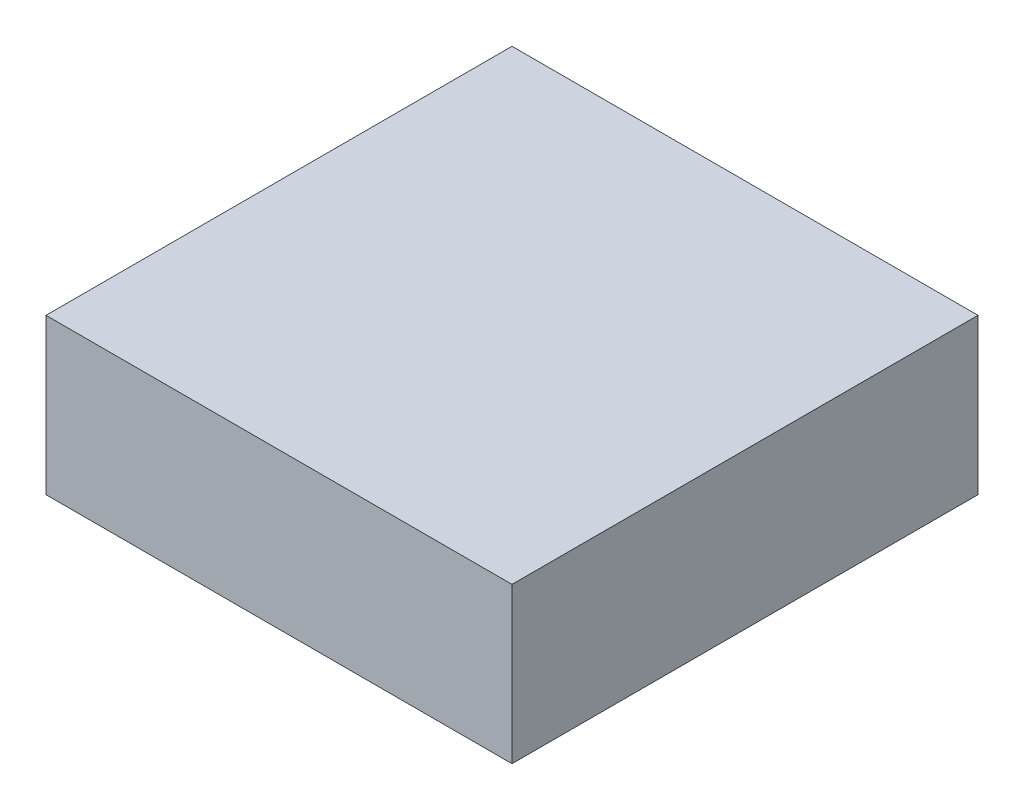
ISO-10303-21;
HEADER;
FILE_DESCRIPTION(('STEP AP214'),'2;1');
FILE_NAME('part.step','',(''),(''),'','','');
FILE_SCHEMA(('AUTOMOTIVE_DESIGN { 1 0 10303 214 1 1 1 1 }'));
ENDSEC;
DATA;
#1=APPLICATION_CONTEXT('core data for automotive mechanical design processes');
#2=APPLICATION_PROTOCOL_DEFINITION('international standard','automotive_design',2000,#1);
#3=PRODUCT_CONTEXT('',#1,'mechanical');
#4=PRODUCT('Part','Part','',(#3));
#5=PRODUCT_RELATED_PRODUCT_CATEGORY('part','',(#4));
#6=PRODUCT_DEFINITION_FORMATION('','',#4);
#7=PRODUCT_DEFINITION_CONTEXT('part definition',#1,'design');
#8=PRODUCT_DEFINITION('design','',#6,#7);
#9=PRODUCT_DEFINITION_SHAPE('','',#8);
#10=(LENGTH_UNIT() NAMED_UNIT(*) SI_UNIT(.MILLI.,.METRE.));
#11=(NAMED_UNIT(*) PLANE_ANGLE_UNIT() SI_UNIT($,.RADIAN.));
#12=(NAMED_UNIT(*) SI_UNIT($,.STERADIAN.) SOLID_ANGLE_UNIT());
#13=UNCERTAINTY_MEASURE_WITH_UNIT(LENGTH_MEASURE(1.E-05),#10,'distance_accuracy_value','');
#14=(GEOMETRIC_REPRESENTATION_CONTEXT(3) GLOBAL_UNCERTAINTY_ASSIGNED_CONTEXT((#13)) GLOBAL_UNIT_ASSIGNED_CONTEXT((#10,
#11,#12)) REPRESENTATION_CONTEXT('',''));
#15=CARTESIAN_POINT('',(0.,0.,0.));
#16=DIRECTION('',(0.,0.,1.));
#17=DIRECTION('',(1.,0.,0.));
#18=AXIS2_PLACEMENT_3D('',#15,#16,#17);
#19=CARTESIAN_POINT('',(11.5,10.,3.49999999999999));
#20=DIRECTION('',(-1.,0.,0.));
#21=DIRECTION('',(0.,0.,1.));
#22=AXIS2_PLACEMENT_3D('',#19,#20,#21);
#23=PLANE('',#22);
#24=DIRECTION('',(0.,-1.,0.));
#25=VECTOR('',#24,1.);
#26=CARTESIAN_POINT('',(11.5,10.,3.49999999999999));
#27=LINE('',#26,#25);
#28=CARTESIAN_POINT('',(11.5,7.,3.49999999999999));
#29=VERTEX_POINT('',#28);
#30=CARTESIAN_POINT('',(11.5,0.,3.49999999999999));
#31=VERTEX_POINT('',#30);
#32=EDGE_CURVE('E62',#29,#31,#27,.T.);
#33=ORIENTED_EDGE('',*,*,#32,.F.);
#34=DIRECTION('',(0.,0.,-1.));
#35=VECTOR('',#34,1.);
#36=CARTESIAN_POINT('',(11.5,7.,0.));
#37=LINE('',#36,#35);
#38=CARTESIAN_POINT('',(11.5,7.,-3.50000000000001));
#39=VERTEX_POINT('',#38);
#40=EDGE_CURVE('E55',#29,#39,#37,.T.);
#41=ORIENTED_EDGE('',*,*,#40,.T.);
#42=DIRECTION('',(0.,-1.,0.));
#43=VECTOR('',#42,1.);
#44=CARTESIAN_POINT('',(11.5,10.,-3.50000000000001));
#45=LINE('',#44,#43);
#46=CARTESIAN_POINT('',(11.5,0.,-3.50000000000001));
#47=VERTEX_POINT('',#46);
#48=EDGE_CURVE('E114',#39,#47,#45,.T.);
#49=ORIENTED_EDGE('',*,*,#48,.T.);
#50=DIRECTION('',(0.,0.,-1.));
#51=VECTOR('',#50,1.);
#52=CARTESIAN_POINT('',(11.5,0.,3.49999999999999));
#53=LINE('',#52,#51);
#54=EDGE_CURVE('E229',#31,#47,#53,.T.);
#55=ORIENTED_EDGE('',*,*,#54,.F.);
#56=EDGE_LOOP('',(#33,#41,#49,#55));
#57=FACE_BOUND('',#56,.T.);
#58=ADVANCED_FACE('F39',(#57),#23,.T.);
#59=CARTESIAN_POINT('',(-11.5,10.,-3.50000000000001));
#60=DIRECTION('',(0.,0.,1.));
#61=DIRECTION('',(1.,0.,0.));
#62=AXIS2_PLACEMENT_3D('',#59,#60,#61);
#63=PLANE('',#62);
#64=ORIENTED_EDGE('',*,*,#48,.F.);
#65=DIRECTION('',(1.,0.,0.));
#66=VECTOR('',#65,1.);
#67=CARTESIAN_POINT('',(0.,7.,-3.50000000000001));
#68=LINE('',#67,#66);
#69=CARTESIAN_POINT('',(-11.5,7.,-3.50000000000001));
#70=VERTEX_POINT('',#69);
#71=EDGE_CURVE('E104',#70,#39,#68,.T.);
#72=ORIENTED_EDGE('',*,*,#71,.F.);
#73=DIRECTION('',(0.,-1.,0.));
#74=VECTOR('',#73,1.);
#75=CARTESIAN_POINT('',(-11.5,10.,-3.50000000000001));
#76=LINE('',#75,#74);
#77=CARTESIAN_POINT('',(-11.5,0.,-3.50000000000001));
#78=VERTEX_POINT('',#77);
#79=EDGE_CURVE('E125',#70,#78,#76,.T.);
#80=ORIENTED_EDGE('',*,*,#79,.T.);
#81=DIRECTION('',(-1.,0.,0.));
#82=VECTOR('',#81,1.);
#83=CARTESIAN_POINT('',(-11.5,0.,-3.50000000000001));
#84=LINE('',#83,#82);
#85=EDGE_CURVE('E121',#47,#78,#84,.T.);
#86=ORIENTED_EDGE('',*,*,#85,.F.);
#87=EDGE_LOOP('',(#64,#72,#80,#86));
#88=FACE_BOUND('',#87,.T.);
#89=ADVANCED_FACE('F119',(#88),#63,.T.);
#90=CARTESIAN_POINT('',(-11.5,10.,3.49999999999999));
#91=DIRECTION('',(1.,0.,0.));
#92=DIRECTION('',(0.,0.,-1.));
#93=AXIS2_PLACEMENT_3D('',#90,#91,#92);
#94=PLANE('',#93);
#95=ORIENTED_EDGE('',*,*,#79,.F.);
#96=DIRECTION('',(0.,0.,-1.));
#97=VECTOR('',#96,1.);
#98=CARTESIAN_POINT('',(-11.5,7.,0.));
#99=LINE('',#98,#97);
#100=CARTESIAN_POINT('',(-11.5,7.,3.49999999999999));
#101=VERTEX_POINT('',#100);
#102=EDGE_CURVE('E107',#101,#70,#99,.T.);
#103=ORIENTED_EDGE('',*,*,#102,.F.);
#104=DIRECTION('',(0.,-1.,0.));
#105=VECTOR('',#104,1.);
#106=CARTESIAN_POINT('',(-11.5,10.,3.49999999999999));
#107=LINE('',#106,#105);
#108=CARTESIAN_POINT('',(-11.5,0.,3.49999999999999));
#109=VERTEX_POINT('',#108);
#110=EDGE_CURVE('E132',#101,#109,#107,.T.);
#111=ORIENTED_EDGE('',*,*,#110,.T.);
#112=DIRECTION('',(0.,0.,1.));
#113=VECTOR('',#112,1.);
#114=CARTESIAN_POINT('',(-11.5,0.,3.49999999999999));
#115=LINE('',#114,#113);
#116=EDGE_CURVE('E224',#78,#109,#115,.T.);
#117=ORIENTED_EDGE('',*,*,#116,.F.);
#118=EDGE_LOOP('',(#95,#103,#111,#117));
#119=FACE_BOUND('',#118,.T.);
#120=ADVANCED_FACE('F199',(#119),#94,.T.);
#121=CARTESIAN_POINT('',(-11.5,10.,3.49999999999999));
#122=DIRECTION('',(0.,0.,-1.));
#123=DIRECTION('',(-1.,0.,0.));
#124=AXIS2_PLACEMENT_3D('',#121,#122,#123);
#125=PLANE('',#124);
#126=ORIENTED_EDGE('',*,*,#110,.F.);
#127=DIRECTION('',(1.,0.,0.));
#128=VECTOR('',#127,1.);
#129=CARTESIAN_POINT('',(0.,7.,3.49999999999999));
#130=LINE('',#129,#128);
#131=EDGE_CURVE('E117',#101,#29,#130,.T.);
#132=ORIENTED_EDGE('',*,*,#131,.T.);
#133=ORIENTED_EDGE('',*,*,#32,.T.);
#134=DIRECTION('',(1.,0.,0.));
#135=VECTOR('',#134,1.);
#136=CARTESIAN_POINT('',(-11.5,0.,3.49999999999999));
#137=LINE('',#136,#135);
#138=EDGE_CURVE('E227',#109,#31,#137,.T.);
#139=ORIENTED_EDGE('',*,*,#138,.F.);
#140=EDGE_LOOP('',(#126,#132,#133,#139));
#141=FACE_BOUND('',#140,.T.);
#142=ADVANCED_FACE('F205',(#141),#125,.T.);
#143=CARTESIAN_POINT('',(0.,10.,0.));
#144=DIRECTION('',(0.,-1.,0.));
#145=DIRECTION('',(0.,0.,-1.));
#146=AXIS2_PLACEMENT_3D('',#143,#144,#145);
#147=PLANE('',#146);
#148=DIRECTION('',(0.,0.,-1.));
#149=VECTOR('',#148,1.);
#150=CARTESIAN_POINT('',(15.,10.,15.));
#151=LINE('',#150,#149);
#152=CARTESIAN_POINT('',(15.,10.,15.));
#153=VERTEX_POINT('',#152);
#154=CARTESIAN_POINT('',(15.,10.,-15.));
#155=VERTEX_POINT('',#154);
#156=EDGE_CURVE('E136',#153,#155,#151,.T.);
#157=ORIENTED_EDGE('',*,*,#156,.T.);
#158=DIRECTION('',(-1.,0.,0.));
#159=VECTOR('',#158,1.);
#160=CARTESIAN_POINT('',(-15.,10.,-15.));
#161=LINE('',#160,#159);
#162=CARTESIAN_POINT('',(-15.,10.,-15.));
#163=VERTEX_POINT('',#162);
#164=EDGE_CURVE('E140',#155,#163,#161,.T.);
#165=ORIENTED_EDGE('',*,*,#164,.T.);
#166=DIRECTION('',(0.,0.,1.));
#167=VECTOR('',#166,1.);
#168=CARTESIAN_POINT('',(-15.,10.,15.));
#169=LINE('',#168,#167);
#170=CARTESIAN_POINT('',(-15.,10.,15.));
#171=VERTEX_POINT('',#170);
#172=EDGE_CURVE('E144',#163,#171,#169,.T.);
#173=ORIENTED_EDGE('',*,*,#172,.T.);
#174=DIRECTION('',(1.,0.,0.));
#175=VECTOR('',#174,1.);
#176=CARTESIAN_POINT('',(-15.,10.,15.));
#177=LINE('',#176,#175);
#178=EDGE_CURVE('E147',#171,#153,#177,.T.);
#179=ORIENTED_EDGE('',*,*,#178,.T.);
#180=EDGE_LOOP('',(#157,#165,#173,#179));
#181=FACE_BOUND('',#180,.T.);
#182=ADVANCED_FACE('F186',(#181),#147,.F.);
#183=CARTESIAN_POINT('',(0.,0.,0.));
#184=DIRECTION('',(0.,-1.,0.));
#185=DIRECTION('',(0.,0.,-1.));
#186=AXIS2_PLACEMENT_3D('',#183,#184,#185);
#187=PLANE('',#186);
#188=DIRECTION('',(0.,0.,-1.));
#189=VECTOR('',#188,1.);
#190=CARTESIAN_POINT('',(15.,0.,15.));
#191=LINE('',#190,#189);
#192=CARTESIAN_POINT('',(15.,0.,15.));
#193=VERTEX_POINT('',#192);
#194=CARTESIAN_POINT('',(15.,0.,-15.));
#195=VERTEX_POINT('',#194);
#196=EDGE_CURVE('E124',#193,#195,#191,.T.);
#197=ORIENTED_EDGE('',*,*,#196,.F.);
#198=DIRECTION('',(1.,0.,0.));
#199=VECTOR('',#198,1.);
#200=CARTESIAN_POINT('',(-15.,0.,15.));
#201=LINE('',#200,#199);
#202=CARTESIAN_POINT('',(-15.,0.,15.));
#203=VERTEX_POINT('',#202);
#204=EDGE_CURVE('E141',#203,#193,#201,.T.);
#205=ORIENTED_EDGE('',*,*,#204,.F.);
#206=DIRECTION('',(0.,0.,1.));
#207=VECTOR('',#206,1.);
#208=CARTESIAN_POINT('',(-15.,0.,15.));
#209=LINE('',#208,#207);
#210=CARTESIAN_POINT('',(-15.,0.,-15.));
#211=VERTEX_POINT('',#210);
#212=EDGE_CURVE('E153',#211,#203,#209,.T.);
#213=ORIENTED_EDGE('',*,*,#212,.F.);
#214=DIRECTION('',(-1.,0.,0.));
#215=VECTOR('',#214,1.);
#216=CARTESIAN_POINT('',(-15.,0.,-15.));
#217=LINE('',#216,#215);
#218=EDGE_CURVE('E130',#195,#211,#217,.T.);
#219=ORIENTED_EDGE('',*,*,#218,.F.);
#220=EDGE_LOOP('',(#197,#205,#213,#219));
#221=FACE_BOUND('',#220,.T.);
#222=ORIENTED_EDGE('',*,*,#138,.T.);
#223=ORIENTED_EDGE('',*,*,#54,.T.);
#224=ORIENTED_EDGE('',*,*,#85,.T.);
#225=ORIENTED_EDGE('',*,*,#116,.T.);
#226=EDGE_LOOP('',(#222,#223,#224,#225));
#227=FACE_BOUND('',#226,.T.);
#228=ADVANCED_FACE('F176',(#221,#227),#187,.T.);
#229=CARTESIAN_POINT('',(15.,10.,15.));
#230=DIRECTION('',(-1.,0.,0.));
#231=DIRECTION('',(0.,0.,1.));
#232=AXIS2_PLACEMENT_3D('',#229,#230,#231);
#233=PLANE('',#232);
#234=ORIENTED_EDGE('',*,*,#196,.T.);
#235=DIRECTION('',(0.,-1.,0.));
#236=VECTOR('',#235,1.);
#237=CARTESIAN_POINT('',(15.,10.,-15.));
#238=LINE('',#237,#236);
#239=EDGE_CURVE('E11',#155,#195,#238,.T.);
#240=ORIENTED_EDGE('',*,*,#239,.F.);
#241=ORIENTED_EDGE('',*,*,#156,.F.);
#242=DIRECTION('',(0.,-1.,0.));
#243=VECTOR('',#242,1.);
#244=CARTESIAN_POINT('',(15.,10.,15.));
#245=LINE('',#244,#243);
#246=EDGE_CURVE('E149',#153,#193,#245,.T.);
#247=ORIENTED_EDGE('',*,*,#246,.T.);
#248=EDGE_LOOP('',(#234,#240,#241,#247));
#249=FACE_BOUND('',#248,.T.);
#250=ADVANCED_FACE('F41',(#249),#233,.F.);
#251=CARTESIAN_POINT('',(-15.,10.,-15.));
#252=DIRECTION('',(0.,0.,1.));
#253=DIRECTION('',(1.,0.,0.));
#254=AXIS2_PLACEMENT_3D('',#251,#252,#253);
#255=PLANE('',#254);
#256=ORIENTED_EDGE('',*,*,#218,.T.);
#257=DIRECTION('',(0.,-1.,0.));
#258=VECTOR('',#257,1.);
#259=CARTESIAN_POINT('',(-15.,10.,-15.));
#260=LINE('',#259,#258);
#261=EDGE_CURVE('E48',#163,#211,#260,.T.);
#262=ORIENTED_EDGE('',*,*,#261,.F.);
#263=ORIENTED_EDGE('',*,*,#164,.F.);
#264=ORIENTED_EDGE('',*,*,#239,.T.);
#265=EDGE_LOOP('',(#256,#262,#263,#264));
#266=FACE_BOUND('',#265,.T.);
#267=ADVANCED_FACE('F187',(#266),#255,.F.);
#268=CARTESIAN_POINT('',(-15.,10.,15.));
#269=DIRECTION('',(1.,0.,0.));
#270=DIRECTION('',(0.,0.,-1.));
#271=AXIS2_PLACEMENT_3D('',#268,#269,#270);
#272=PLANE('',#271);
#273=ORIENTED_EDGE('',*,*,#212,.T.);
#274=DIRECTION('',(0.,-1.,0.));
#275=VECTOR('',#274,1.);
#276=CARTESIAN_POINT('',(-15.,10.,15.));
#277=LINE('',#276,#275);
#278=EDGE_CURVE('E161',#171,#203,#277,.T.);
#279=ORIENTED_EDGE('',*,*,#278,.F.);
#280=ORIENTED_EDGE('',*,*,#172,.F.);
#281=ORIENTED_EDGE('',*,*,#261,.T.);
#282=EDGE_LOOP('',(#273,#279,#280,#281));
#283=FACE_BOUND('',#282,.T.);
#284=ADVANCED_FACE('F170',(#283),#272,.F.);
#285=CARTESIAN_POINT('',(-15.,10.,15.));
#286=DIRECTION('',(0.,0.,-1.));
#287=DIRECTION('',(-1.,0.,0.));
#288=AXIS2_PLACEMENT_3D('',#285,#286,#287);
#289=PLANE('',#288);
#290=ORIENTED_EDGE('',*,*,#204,.T.);
#291=ORIENTED_EDGE('',*,*,#246,.F.);
#292=ORIENTED_EDGE('',*,*,#178,.F.);
#293=ORIENTED_EDGE('',*,*,#278,.T.);
#294=EDGE_LOOP('',(#290,#291,#292,#293));
#295=FACE_BOUND('',#294,.T.);
#296=ADVANCED_FACE('F180',(#295),#289,.F.);
#297=CARTESIAN_POINT('',(0.,7.,0.));
#298=DIRECTION('',(0.,1.,0.));
#299=DIRECTION('',(0.,0.,1.));
#300=AXIS2_PLACEMENT_3D('',#297,#298,#299);
#301=PLANE('',#300);
#302=ORIENTED_EDGE('',*,*,#131,.F.);
#303=ORIENTED_EDGE('',*,*,#102,.T.);
#304=ORIENTED_EDGE('',*,*,#71,.T.);
#305=ORIENTED_EDGE('',*,*,#40,.F.);
#306=EDGE_LOOP('',(#302,#303,#304,#305));
#307=FACE_BOUND('',#306,.T.);
#308=ADVANCED_FACE('F105',(#307),#301,.F.);
#309=CLOSED_SHELL('',(#58,#89,#120,#142,#182,#228,#250,#267,#284,#296,#308));
#310=MANIFOLD_SOLID_BREP('B2',#309);
#311=ADVANCED_BREP_SHAPE_REPRESENTATION('',(#18,#310),#14);
#312=SHAPE_DEFINITION_REPRESENTATION(#9,#311);
ENDSEC;
END-ISO-10303-21;
